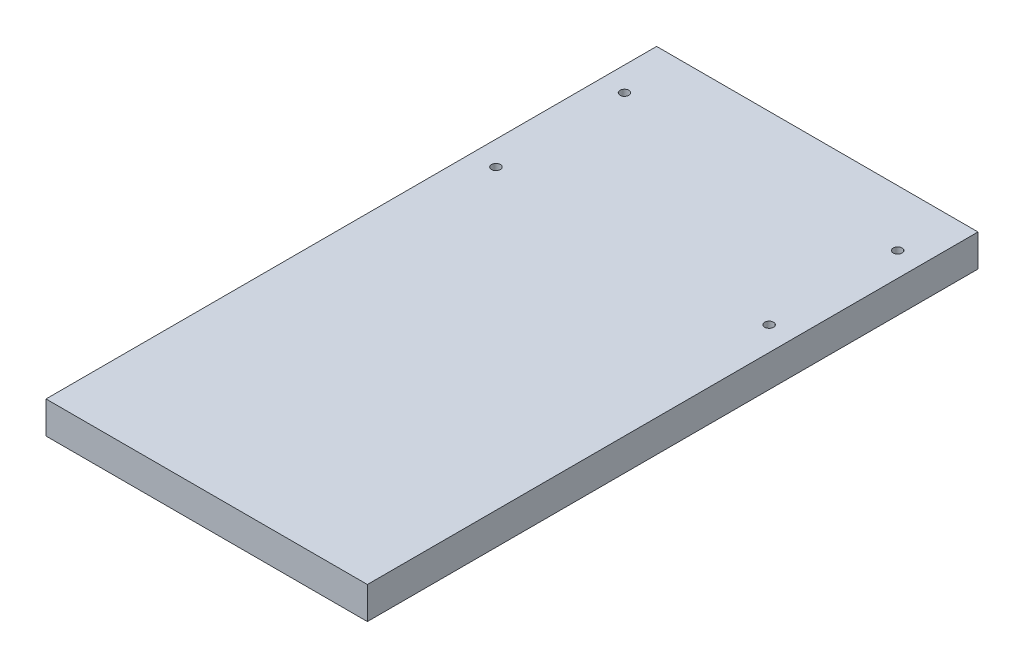
ISO-10303-21;
HEADER;
FILE_DESCRIPTION(('STEP AP214'),'2;1');
FILE_NAME('part.step','',(''),(''),'','','');
FILE_SCHEMA(('AUTOMOTIVE_DESIGN { 1 0 10303 214 1 1 1 1 }'));
ENDSEC;
DATA;
#1=APPLICATION_CONTEXT('core data for automotive mechanical design processes');
#2=APPLICATION_PROTOCOL_DEFINITION('international standard','automotive_design',2000,#1);
#3=PRODUCT_CONTEXT('',#1,'mechanical');
#4=PRODUCT('Part','Part','',(#3));
#5=PRODUCT_RELATED_PRODUCT_CATEGORY('part','',(#4));
#6=PRODUCT_DEFINITION_FORMATION('','',#4);
#7=PRODUCT_DEFINITION_CONTEXT('part definition',#1,'design');
#8=PRODUCT_DEFINITION('design','',#6,#7);
#9=PRODUCT_DEFINITION_SHAPE('','',#8);
#10=(LENGTH_UNIT() NAMED_UNIT(*) SI_UNIT(.MILLI.,.METRE.));
#11=(NAMED_UNIT(*) PLANE_ANGLE_UNIT() SI_UNIT($,.RADIAN.));
#12=(NAMED_UNIT(*) SI_UNIT($,.STERADIAN.) SOLID_ANGLE_UNIT());
#13=UNCERTAINTY_MEASURE_WITH_UNIT(LENGTH_MEASURE(1.E-05),#10,'distance_accuracy_value','');
#14=(GEOMETRIC_REPRESENTATION_CONTEXT(3) GLOBAL_UNCERTAINTY_ASSIGNED_CONTEXT((#13)) GLOBAL_UNIT_ASSIGNED_CONTEXT((#10,
#11,#12)) REPRESENTATION_CONTEXT('',''));
#15=CARTESIAN_POINT('',(0.,0.,0.));
#16=DIRECTION('',(0.,0.,1.));
#17=DIRECTION('',(1.,0.,0.));
#18=AXIS2_PLACEMENT_3D('',#15,#16,#17);
#19=CARTESIAN_POINT('',(0.,10.,0.));
#20=DIRECTION('',(0.,1.,0.));
#21=DIRECTION('',(0.,0.,1.));
#22=AXIS2_PLACEMENT_3D('',#19,#20,#21);
#23=PLANE('',#22);
#24=CARTESIAN_POINT('',(42.5,10.,-37.5));
#25=DIRECTION('',(0.,-1.,0.));
#26=DIRECTION('',(0.,0.,-1.));
#27=AXIS2_PLACEMENT_3D('',#24,#25,#26);
#28=CIRCLE('',#27,1.375);
#29=CARTESIAN_POINT('',(42.5,10.,-38.875));
#30=VERTEX_POINT('',#29);
#31=EDGE_CURVE('E133',#30,#30,#28,.T.);
#32=ORIENTED_EDGE('',*,*,#31,.T.);
#33=EDGE_LOOP('',(#32));
#34=FACE_BOUND('',#33,.T.);
#35=CARTESIAN_POINT('',(-42.5,10.,-37.5));
#36=DIRECTION('',(0.,1.,0.));
#37=DIRECTION('',(0.,0.,1.));
#38=AXIS2_PLACEMENT_3D('',#35,#36,#37);
#39=CIRCLE('',#38,1.375);
#40=CARTESIAN_POINT('',(-42.5,10.,-36.125));
#41=VERTEX_POINT('',#40);
#42=EDGE_CURVE('E121',#41,#41,#39,.T.);
#43=ORIENTED_EDGE('',*,*,#42,.F.);
#44=EDGE_LOOP('',(#43));
#45=FACE_BOUND('',#44,.T.);
#46=CARTESIAN_POINT('',(-42.5,10.,-77.5));
#47=DIRECTION('',(0.,1.,0.));
#48=DIRECTION('',(0.,0.,1.));
#49=AXIS2_PLACEMENT_3D('',#46,#47,#48);
#50=CIRCLE('',#49,1.375);
#51=CARTESIAN_POINT('',(-42.5,10.,-76.125));
#52=VERTEX_POINT('',#51);
#53=EDGE_CURVE('E118',#52,#52,#50,.T.);
#54=ORIENTED_EDGE('',*,*,#53,.F.);
#55=EDGE_LOOP('',(#54));
#56=FACE_BOUND('',#55,.T.);
#57=DIRECTION('',(1.,0.,0.));
#58=VECTOR('',#57,1.);
#59=CARTESIAN_POINT('',(0.,10.,95.));
#60=LINE('',#59,#58);
#61=CARTESIAN_POINT('',(-50.,10.,95.));
#62=VERTEX_POINT('',#61);
#63=CARTESIAN_POINT('',(50.,10.,95.));
#64=VERTEX_POINT('',#63);
#65=EDGE_CURVE('E92',#62,#64,#60,.T.);
#66=ORIENTED_EDGE('',*,*,#65,.T.);
#67=DIRECTION('',(0.,0.,-1.));
#68=VECTOR('',#67,1.);
#69=CARTESIAN_POINT('',(50.,10.,0.));
#70=LINE('',#69,#68);
#71=CARTESIAN_POINT('',(50.,10.,-95.));
#72=VERTEX_POINT('',#71);
#73=EDGE_CURVE('E84',#64,#72,#70,.T.);
#74=ORIENTED_EDGE('',*,*,#73,.T.);
#75=DIRECTION('',(1.,0.,0.));
#76=VECTOR('',#75,1.);
#77=CARTESIAN_POINT('',(0.,10.,-95.));
#78=LINE('',#77,#76);
#79=CARTESIAN_POINT('',(-50.,10.,-95.));
#80=VERTEX_POINT('',#79);
#81=EDGE_CURVE('E91',#80,#72,#78,.T.);
#82=ORIENTED_EDGE('',*,*,#81,.F.);
#83=DIRECTION('',(0.,0.,-1.));
#84=VECTOR('',#83,1.);
#85=CARTESIAN_POINT('',(-50.,10.,0.));
#86=LINE('',#85,#84);
#87=EDGE_CURVE('E101',#62,#80,#86,.T.);
#88=ORIENTED_EDGE('',*,*,#87,.F.);
#89=EDGE_LOOP('',(#66,#74,#82,#88));
#90=FACE_BOUND('',#89,.T.);
#91=CARTESIAN_POINT('',(42.5,10.,-77.5));
#92=DIRECTION('',(0.,-1.,0.));
#93=DIRECTION('',(0.,0.,-1.));
#94=AXIS2_PLACEMENT_3D('',#91,#92,#93);
#95=CIRCLE('',#94,1.375);
#96=CARTESIAN_POINT('',(42.5,10.,-78.875));
#97=VERTEX_POINT('',#96);
#98=EDGE_CURVE('E127',#97,#97,#95,.T.);
#99=ORIENTED_EDGE('',*,*,#98,.T.);
#100=EDGE_LOOP('',(#99));
#101=FACE_BOUND('',#100,.T.);
#102=ADVANCED_FACE('F42',(#34,#45,#56,#90,#101),#23,.T.);
#103=CARTESIAN_POINT('',(0.,10.,95.));
#104=DIRECTION('',(0.,0.,-1.));
#105=DIRECTION('',(-1.,0.,0.));
#106=AXIS2_PLACEMENT_3D('',#103,#104,#105);
#107=PLANE('',#106);
#108=DIRECTION('',(1.,0.,0.));
#109=VECTOR('',#108,1.);
#110=CARTESIAN_POINT('',(0.,0.,95.));
#111=LINE('',#110,#109);
#112=CARTESIAN_POINT('',(-50.,0.,95.));
#113=VERTEX_POINT('',#112);
#114=CARTESIAN_POINT('',(50.,0.,95.));
#115=VERTEX_POINT('',#114);
#116=EDGE_CURVE('E106',#113,#115,#111,.T.);
#117=ORIENTED_EDGE('',*,*,#116,.T.);
#118=DIRECTION('',(0.,-1.,0.));
#119=VECTOR('',#118,1.);
#120=CARTESIAN_POINT('',(50.,10.,95.));
#121=LINE('',#120,#119);
#122=EDGE_CURVE('E11',#64,#115,#121,.T.);
#123=ORIENTED_EDGE('',*,*,#122,.F.);
#124=ORIENTED_EDGE('',*,*,#65,.F.);
#125=DIRECTION('',(0.,-1.,0.));
#126=VECTOR('',#125,1.);
#127=CARTESIAN_POINT('',(-50.,10.,95.));
#128=LINE('',#127,#126);
#129=EDGE_CURVE('E59',#62,#113,#128,.T.);
#130=ORIENTED_EDGE('',*,*,#129,.T.);
#131=EDGE_LOOP('',(#117,#123,#124,#130));
#132=FACE_BOUND('',#131,.T.);
#133=ADVANCED_FACE('F44',(#132),#107,.F.);
#134=CARTESIAN_POINT('',(50.,10.,0.));
#135=DIRECTION('',(-1.,0.,0.));
#136=DIRECTION('',(0.,0.,1.));
#137=AXIS2_PLACEMENT_3D('',#134,#135,#136);
#138=PLANE('',#137);
#139=DIRECTION('',(0.,0.,-1.));
#140=VECTOR('',#139,1.);
#141=CARTESIAN_POINT('',(50.,0.,0.));
#142=LINE('',#141,#140);
#143=CARTESIAN_POINT('',(50.,0.,-95.));
#144=VERTEX_POINT('',#143);
#145=EDGE_CURVE('E97',#115,#144,#142,.T.);
#146=ORIENTED_EDGE('',*,*,#145,.T.);
#147=DIRECTION('',(0.,-1.,0.));
#148=VECTOR('',#147,1.);
#149=CARTESIAN_POINT('',(50.,10.,-95.));
#150=LINE('',#149,#148);
#151=EDGE_CURVE('E51',#72,#144,#150,.T.);
#152=ORIENTED_EDGE('',*,*,#151,.F.);
#153=ORIENTED_EDGE('',*,*,#73,.F.);
#154=ORIENTED_EDGE('',*,*,#122,.T.);
#155=EDGE_LOOP('',(#146,#152,#153,#154));
#156=FACE_BOUND('',#155,.T.);
#157=ADVANCED_FACE('F96',(#156),#138,.F.);
#158=CARTESIAN_POINT('',(0.,10.,-95.));
#159=DIRECTION('',(0.,0.,-1.));
#160=DIRECTION('',(-1.,0.,0.));
#161=AXIS2_PLACEMENT_3D('',#158,#159,#160);
#162=PLANE('',#161);
#163=DIRECTION('',(1.,0.,0.));
#164=VECTOR('',#163,1.);
#165=CARTESIAN_POINT('',(0.,0.,-95.));
#166=LINE('',#165,#164);
#167=CARTESIAN_POINT('',(-50.,0.,-95.));
#168=VERTEX_POINT('',#167);
#169=EDGE_CURVE('E110',#168,#144,#166,.T.);
#170=ORIENTED_EDGE('',*,*,#169,.F.);
#171=DIRECTION('',(0.,-1.,0.));
#172=VECTOR('',#171,1.);
#173=CARTESIAN_POINT('',(-50.,10.,-95.));
#174=LINE('',#173,#172);
#175=EDGE_CURVE('E73',#80,#168,#174,.T.);
#176=ORIENTED_EDGE('',*,*,#175,.F.);
#177=ORIENTED_EDGE('',*,*,#81,.T.);
#178=ORIENTED_EDGE('',*,*,#151,.T.);
#179=EDGE_LOOP('',(#170,#176,#177,#178));
#180=FACE_BOUND('',#179,.T.);
#181=ADVANCED_FACE('F100',(#180),#162,.T.);
#182=CARTESIAN_POINT('',(-50.,10.,0.));
#183=DIRECTION('',(-1.,0.,0.));
#184=DIRECTION('',(0.,0.,1.));
#185=AXIS2_PLACEMENT_3D('',#182,#183,#184);
#186=PLANE('',#185);
#187=DIRECTION('',(0.,0.,-1.));
#188=VECTOR('',#187,1.);
#189=CARTESIAN_POINT('',(-50.,0.,0.));
#190=LINE('',#189,#188);
#191=EDGE_CURVE('E112',#113,#168,#190,.T.);
#192=ORIENTED_EDGE('',*,*,#191,.F.);
#193=ORIENTED_EDGE('',*,*,#129,.F.);
#194=ORIENTED_EDGE('',*,*,#87,.T.);
#195=ORIENTED_EDGE('',*,*,#175,.T.);
#196=EDGE_LOOP('',(#192,#193,#194,#195));
#197=FACE_BOUND('',#196,.T.);
#198=ADVANCED_FACE('F163',(#197),#186,.T.);
#199=CARTESIAN_POINT('',(0.,0.,0.));
#200=DIRECTION('',(0.,1.,0.));
#201=DIRECTION('',(0.,0.,1.));
#202=AXIS2_PLACEMENT_3D('',#199,#200,#201);
#203=PLANE('',#202);
#204=ORIENTED_EDGE('',*,*,#116,.F.);
#205=ORIENTED_EDGE('',*,*,#191,.T.);
#206=ORIENTED_EDGE('',*,*,#169,.T.);
#207=ORIENTED_EDGE('',*,*,#145,.F.);
#208=EDGE_LOOP('',(#204,#205,#206,#207));
#209=FACE_BOUND('',#208,.T.);
#210=ADVANCED_FACE('F153',(#209),#203,.F.);
#211=CARTESIAN_POINT('',(-42.5,3.,-77.5));
#212=DIRECTION('',(0.,1.,0.));
#213=DIRECTION('',(0.,0.,1.));
#214=AXIS2_PLACEMENT_3D('',#211,#212,#213);
#215=CYLINDRICAL_SURFACE('',#214,1.375);
#216=CARTESIAN_POINT('',(-42.5,3.,-77.5));
#217=DIRECTION('',(0.,1.,0.));
#218=DIRECTION('',(0.,0.,1.));
#219=AXIS2_PLACEMENT_3D('',#216,#217,#218);
#220=CIRCLE('',#219,1.375);
#221=CARTESIAN_POINT('',(-42.5,3.,-76.125));
#222=VERTEX_POINT('',#221);
#223=EDGE_CURVE('E108',#222,#222,#220,.T.);
#224=ORIENTED_EDGE('',*,*,#223,.F.);
#225=EDGE_LOOP('',(#224));
#226=FACE_BOUND('',#225,.T.);
#227=ORIENTED_EDGE('',*,*,#53,.T.);
#228=EDGE_LOOP('',(#227));
#229=FACE_BOUND('',#228,.T.);
#230=ADVANCED_FACE('F150',(#226,#229),#215,.F.);
#231=CARTESIAN_POINT('',(-42.5,3.,-77.5));
#232=DIRECTION('',(0.,1.,0.));
#233=DIRECTION('',(0.,0.,1.));
#234=AXIS2_PLACEMENT_3D('',#231,#232,#233);
#235=PLANE('',#234);
#236=ORIENTED_EDGE('',*,*,#223,.T.);
#237=EDGE_LOOP('',(#236));
#238=FACE_BOUND('',#237,.T.);
#239=ADVANCED_FACE('F152',(#238),#235,.T.);
#240=CARTESIAN_POINT('',(-42.5,3.,-37.5));
#241=DIRECTION('',(0.,1.,0.));
#242=DIRECTION('',(0.,0.,1.));
#243=AXIS2_PLACEMENT_3D('',#240,#241,#242);
#244=CYLINDRICAL_SURFACE('',#243,1.375);
#245=CARTESIAN_POINT('',(-42.5,3.,-37.5));
#246=DIRECTION('',(0.,1.,0.));
#247=DIRECTION('',(0.,0.,1.));
#248=AXIS2_PLACEMENT_3D('',#245,#246,#247);
#249=CIRCLE('',#248,1.375);
#250=CARTESIAN_POINT('',(-42.5,3.,-36.125));
#251=VERTEX_POINT('',#250);
#252=EDGE_CURVE('E136',#251,#251,#249,.T.);
#253=ORIENTED_EDGE('',*,*,#252,.F.);
#254=EDGE_LOOP('',(#253));
#255=FACE_BOUND('',#254,.T.);
#256=ORIENTED_EDGE('',*,*,#42,.T.);
#257=EDGE_LOOP('',(#256));
#258=FACE_BOUND('',#257,.T.);
#259=ADVANCED_FACE('F142',(#255,#258),#244,.F.);
#260=CARTESIAN_POINT('',(-42.5,3.,-37.5));
#261=DIRECTION('',(0.,1.,0.));
#262=DIRECTION('',(0.,0.,1.));
#263=AXIS2_PLACEMENT_3D('',#260,#261,#262);
#264=PLANE('',#263);
#265=ORIENTED_EDGE('',*,*,#252,.T.);
#266=EDGE_LOOP('',(#265));
#267=FACE_BOUND('',#266,.T.);
#268=ADVANCED_FACE('F229',(#267),#264,.T.);
#269=CARTESIAN_POINT('',(42.5,3.,-37.5));
#270=DIRECTION('',(0.,1.,0.));
#271=DIRECTION('',(0.,0.,1.));
#272=AXIS2_PLACEMENT_3D('',#269,#270,#271);
#273=CYLINDRICAL_SURFACE('',#272,1.375);
#274=CARTESIAN_POINT('',(42.5,3.,-37.5));
#275=DIRECTION('',(0.,-1.,0.));
#276=DIRECTION('',(0.,0.,-1.));
#277=AXIS2_PLACEMENT_3D('',#274,#275,#276);
#278=CIRCLE('',#277,1.375);
#279=CARTESIAN_POINT('',(42.5,3.,-38.875));
#280=VERTEX_POINT('',#279);
#281=EDGE_CURVE('E130',#280,#280,#278,.T.);
#282=ORIENTED_EDGE('',*,*,#281,.T.);
#283=EDGE_LOOP('',(#282));
#284=FACE_BOUND('',#283,.T.);
#285=ORIENTED_EDGE('',*,*,#31,.F.);
#286=EDGE_LOOP('',(#285));
#287=FACE_BOUND('',#286,.T.);
#288=ADVANCED_FACE('F240',(#284,#287),#273,.F.);
#289=CARTESIAN_POINT('',(42.5,3.,-37.5));
#290=DIRECTION('',(0.,-1.,0.));
#291=DIRECTION('',(0.,0.,-1.));
#292=AXIS2_PLACEMENT_3D('',#289,#290,#291);
#293=PLANE('',#292);
#294=ORIENTED_EDGE('',*,*,#281,.F.);
#295=EDGE_LOOP('',(#294));
#296=FACE_BOUND('',#295,.T.);
#297=ADVANCED_FACE('F251',(#296),#293,.F.);
#298=CARTESIAN_POINT('',(42.5,3.,-77.5));
#299=DIRECTION('',(0.,1.,0.));
#300=DIRECTION('',(0.,0.,1.));
#301=AXIS2_PLACEMENT_3D('',#298,#299,#300);
#302=CYLINDRICAL_SURFACE('',#301,1.375);
#303=CARTESIAN_POINT('',(42.5,3.,-77.5));
#304=DIRECTION('',(0.,-1.,0.));
#305=DIRECTION('',(0.,0.,-1.));
#306=AXIS2_PLACEMENT_3D('',#303,#304,#305);
#307=CIRCLE('',#306,1.375);
#308=CARTESIAN_POINT('',(42.5,3.,-78.875));
#309=VERTEX_POINT('',#308);
#310=EDGE_CURVE('E124',#309,#309,#307,.T.);
#311=ORIENTED_EDGE('',*,*,#310,.T.);
#312=EDGE_LOOP('',(#311));
#313=FACE_BOUND('',#312,.T.);
#314=ORIENTED_EDGE('',*,*,#98,.F.);
#315=EDGE_LOOP('',(#314));
#316=FACE_BOUND('',#315,.T.);
#317=ADVANCED_FACE('F262',(#313,#316),#302,.F.);
#318=CARTESIAN_POINT('',(42.5,3.,-77.5));
#319=DIRECTION('',(0.,-1.,0.));
#320=DIRECTION('',(0.,0.,-1.));
#321=AXIS2_PLACEMENT_3D('',#318,#319,#320);
#322=PLANE('',#321);
#323=ORIENTED_EDGE('',*,*,#310,.F.);
#324=EDGE_LOOP('',(#323));
#325=FACE_BOUND('',#324,.T.);
#326=ADVANCED_FACE('F273',(#325),#322,.F.);
#327=CLOSED_SHELL('',(#102,#133,#157,#181,#198,#210,#230,#239,#259,#268,#288,#297,#317,#326));
#328=MANIFOLD_SOLID_BREP('B2',#327);
#329=ADVANCED_BREP_SHAPE_REPRESENTATION('',(#18,#328),#14);
#330=SHAPE_DEFINITION_REPRESENTATION(#9,#329);
ENDSEC;
END-ISO-10303-21;
